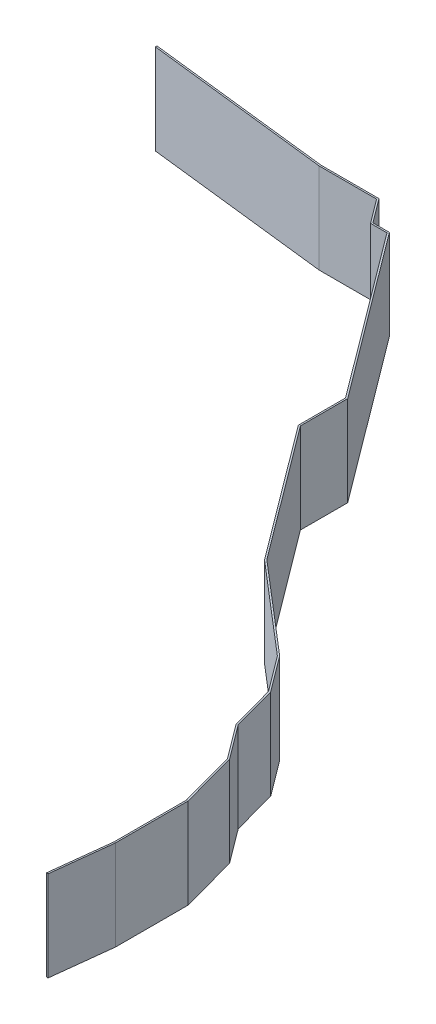
ISO-10303-21;
HEADER;
FILE_DESCRIPTION(('STEP AP214'),'2;1');
FILE_NAME('part.step','',(''),(''),'','','');
FILE_SCHEMA(('AUTOMOTIVE_DESIGN { 1 0 10303 214 1 1 1 1 }'));
ENDSEC;
DATA;
#1=APPLICATION_CONTEXT('core data for automotive mechanical design processes');
#2=APPLICATION_PROTOCOL_DEFINITION('international standard','automotive_design',2000,#1);
#3=PRODUCT_CONTEXT('',#1,'mechanical');
#4=PRODUCT('Part','Part','',(#3));
#5=PRODUCT_RELATED_PRODUCT_CATEGORY('part','',(#4));
#6=PRODUCT_DEFINITION_FORMATION('','',#4);
#7=PRODUCT_DEFINITION_CONTEXT('part definition',#1,'design');
#8=PRODUCT_DEFINITION('design','',#6,#7);
#9=PRODUCT_DEFINITION_SHAPE('','',#8);
#10=(LENGTH_UNIT() NAMED_UNIT(*) SI_UNIT(.MILLI.,.METRE.));
#11=(NAMED_UNIT(*) PLANE_ANGLE_UNIT() SI_UNIT($,.RADIAN.));
#12=(NAMED_UNIT(*) SI_UNIT($,.STERADIAN.) SOLID_ANGLE_UNIT());
#13=UNCERTAINTY_MEASURE_WITH_UNIT(LENGTH_MEASURE(1.E-05),#10,'distance_accuracy_value','');
#14=(GEOMETRIC_REPRESENTATION_CONTEXT(3) GLOBAL_UNCERTAINTY_ASSIGNED_CONTEXT((#13)) GLOBAL_UNIT_ASSIGNED_CONTEXT((#10,
#11,#12)) REPRESENTATION_CONTEXT('',''));
#15=CARTESIAN_POINT('',(0.,0.,0.));
#16=DIRECTION('',(0.,0.,1.));
#17=DIRECTION('',(1.,0.,0.));
#18=AXIS2_PLACEMENT_3D('',#15,#16,#17);
#19=CARTESIAN_POINT('',(0.,-143.002,0.));
#20=DIRECTION('',(0.,-1.,0.));
#21=DIRECTION('',(-1.,0.,0.));
#22=AXIS2_PLACEMENT_3D('',#19,#20,#21);
#23=PLANE('',#22);
#24=DIRECTION('',(-0.993474499826369,0.,-0.114054452761589));
#25=VECTOR('',#24,1.);
#26=CARTESIAN_POINT('',(-563.408799350654,-143.002,-356.070301017188));
#27=LINE('',#26,#25);
#28=CARTESIAN_POINT('',(-482.977728206431,-143.002,-346.836524200585));
#29=VERTEX_POINT('',#28);
#30=CARTESIAN_POINT('',(-776.424862409459,-143.002,-380.525312701783));
#31=VERTEX_POINT('',#30);
#32=EDGE_CURVE('E140',#29,#31,#27,.T.);
#33=ORIENTED_EDGE('',*,*,#32,.T.);
#34=DIRECTION('',(-0.114054452761553,0.,0.993474499826373));
#35=VECTOR('',#34,1.);
#36=CARTESIAN_POINT('',(-776.135164099445,-143.002,-383.048737931342));
#37=LINE('',#36,#35);
#38=CARTESIAN_POINT('',(-776.135164099445,-143.002,-383.048737931342));
#39=VERTEX_POINT('',#38);
#40=EDGE_CURVE('E377',#39,#31,#37,.T.);
#41=ORIENTED_EDGE('',*,*,#40,.F.);
#42=DIRECTION('',(-0.993474499826369,0.,-0.114054452761589));
#43=VECTOR('',#42,1.);
#44=CARTESIAN_POINT('',(-482.688029896416,-143.002,-349.359949430144));
#45=LINE('',#44,#43);
#46=CARTESIAN_POINT('',(-482.832404897786,-143.002,-349.376524200585));
#47=VERTEX_POINT('',#46);
#48=EDGE_CURVE('E233',#47,#39,#45,.T.);
#49=ORIENTED_EDGE('',*,*,#48,.F.);
#50=DIRECTION('',(1.,0.,0.));
#51=VECTOR('',#50,1.);
#52=CARTESIAN_POINT('',(-392.100936643089,-143.002,-349.376524200585));
#53=LINE('',#52,#51);
#54=CARTESIAN_POINT('',(-390.827778697246,-143.002,-349.376524200585));
#55=VERTEX_POINT('',#54);
#56=EDGE_CURVE('E222',#55,#47,#53,.F.);
#57=ORIENTED_EDGE('',*,*,#56,.F.);
#58=DIRECTION('',(-0.598408200865887,0.,-0.801191378595933));
#59=VECTOR('',#58,1.);
#60=CARTESIAN_POINT('',(-361.626176914644,-143.002,-310.279346796335));
#61=LINE('',#60,#59);
#62=CARTESIAN_POINT('',(-362.388045070435,-143.002,-311.299389966135));
#63=VERTEX_POINT('',#62);
#64=EDGE_CURVE('E207',#63,#55,#61,.T.);
#65=ORIENTED_EDGE('',*,*,#64,.F.);
#66=DIRECTION('',(1.,0.,0.));
#67=VECTOR('',#66,1.);
#68=CARTESIAN_POINT('',(-337.521866174316,-143.002,-311.299389966135));
#69=LINE('',#68,#67);
#70=CARTESIAN_POINT('',(-336.248708228473,-143.002,-311.299389966135));
#71=VERTEX_POINT('',#70);
#72=EDGE_CURVE('E220',#71,#63,#69,.F.);
#73=ORIENTED_EDGE('',*,*,#72,.F.);
#74=DIRECTION('',(-0.598408200865888,0.,-0.801191378595933));
#75=VECTOR('',#74,1.);
#76=CARTESIAN_POINT('',(-141.669839765425,-143.002,-50.7833882736982));
#77=LINE('',#76,#75);
#78=CARTESIAN_POINT('',(-141.164865867059,-143.002,-50.107293371921));
#79=VERTEX_POINT('',#78);
#80=EDGE_CURVE('E226',#79,#71,#77,.T.);
#81=ORIENTED_EDGE('',*,*,#80,.F.);
#82=DIRECTION('',(0.,0.,-1.));
#83=VECTOR('',#82,1.);
#84=CARTESIAN_POINT('',(-141.164865867059,-143.002,25.633038126932));
#85=LINE('',#84,#83);
#86=CARTESIAN_POINT('',(-141.164865867059,-143.002,24.7891761985098));
#87=VERTEX_POINT('',#86);
#88=EDGE_CURVE('E228',#87,#79,#85,.T.);
#89=ORIENTED_EDGE('',*,*,#88,.F.);
#90=DIRECTION('',(-0.598408200865888,0.,-0.801191378595933));
#91=VECTOR('',#90,1.);
#92=CARTESIAN_POINT('',(16.1849403912106,-143.002,235.460266627164));
#93=LINE('',#92,#91);
#94=CARTESIAN_POINT('',(16.0164872488637,-143.002,235.234729602186));
#95=VERTEX_POINT('',#94);
#96=EDGE_CURVE('E448',#95,#87,#93,.T.);
#97=ORIENTED_EDGE('',*,*,#96,.F.);
#98=DIRECTION('',(-0.759319771854139,0.,-0.650717668479486));
#99=VECTOR('',#98,1.);
#100=CARTESIAN_POINT('',(158.194553840272,-143.002,357.077704631492));
#101=LINE('',#100,#99);
#102=CARTESIAN_POINT('',(158.408303921621,-143.002,357.260882996824));
#103=VERTEX_POINT('',#102);
#104=EDGE_CURVE('E446',#103,#95,#101,.T.);
#105=ORIENTED_EDGE('',*,*,#104,.F.);
#106=DIRECTION('',(-0.598408200865888,0.,-0.801191378595933));
#107=VECTOR('',#106,1.);
#108=CARTESIAN_POINT('',(200.130594881591,-143.002,413.121647879442));
#109=LINE('',#108,#107);
#110=CARTESIAN_POINT('',(200.41871043104,-143.002,413.507397429537));
#111=VERTEX_POINT('',#110);
#112=EDGE_CURVE('E443',#111,#103,#109,.T.);
#113=ORIENTED_EDGE('',*,*,#112,.F.);
#114=DIRECTION('',(-0.263692156695389,0.,-0.96460688702566));
#115=VECTOR('',#114,1.);
#116=CARTESIAN_POINT('',(219.908842480194,-143.002,484.803850988343));
#117=LINE('',#116,#115);
#118=CARTESIAN_POINT('',(219.781882638231,-143.002,484.339421786245));
#119=VERTEX_POINT('',#118);
#120=EDGE_CURVE('E440',#119,#111,#117,.T.);
#121=ORIENTED_EDGE('',*,*,#120,.F.);
#122=DIRECTION('',(-0.598408200865888,0.,-0.801191378595933));
#123=VECTOR('',#122,1.);
#124=CARTESIAN_POINT('',(259.759952794934,-143.002,537.864900040231));
#125=LINE('',#124,#123);
#126=CARTESIAN_POINT('',(260.048068344382,-143.002,538.250649590326));
#127=VERTEX_POINT('',#126);
#128=EDGE_CURVE('E437',#127,#119,#125,.T.);
#129=ORIENTED_EDGE('',*,*,#128,.F.);
#130=DIRECTION('',(-0.263692156695389,0.,-0.96460688702566));
#131=VECTOR('',#130,1.);
#132=CARTESIAN_POINT('',(284.635727832471,-143.002,628.194264050768));
#133=LINE('',#132,#131);
#134=CARTESIAN_POINT('',(284.725626339426,-143.002,628.523119941018));
#135=VERTEX_POINT('',#134);
#136=EDGE_CURVE('E434',#135,#127,#133,.T.);
#137=ORIENTED_EDGE('',*,*,#136,.F.);
#138=DIRECTION('',(0.,0.,-1.));
#139=VECTOR('',#138,1.);
#140=CARTESIAN_POINT('',(284.725626339426,-143.002,746.088969302865));
#141=LINE('',#140,#139);
#142=CARTESIAN_POINT('',(284.725626339426,-143.002,743.823886816723));
#143=VERTEX_POINT('',#142);
#144=EDGE_CURVE('E431',#143,#135,#141,.T.);
#145=ORIENTED_EDGE('',*,*,#144,.F.);
#146=DIRECTION('',(0.11405445276159,0.,-0.993474499826369));
#147=VECTOR('',#146,1.);
#148=CARTESIAN_POINT('',(273.717090558877,-143.002,839.714045539964));
#149=LINE('',#148,#147);
#150=CARTESIAN_POINT('',(273.717090558877,-143.002,839.714045539964));
#151=VERTEX_POINT('',#150);
#152=EDGE_CURVE('E395',#151,#143,#149,.T.);
#153=ORIENTED_EDGE('',*,*,#152,.F.);
#154=DIRECTION('',(0.993474499826368,0.,0.114054452761603));
#155=VECTOR('',#154,1.);
#156=CARTESIAN_POINT('',(271.177090558877,-143.002,839.422444386573));
#157=LINE('',#156,#155);
#158=CARTESIAN_POINT('',(271.177090558877,-143.002,839.422444386573));
#159=VERTEX_POINT('',#158);
#160=EDGE_CURVE('E375',#159,#151,#157,.T.);
#161=ORIENTED_EDGE('',*,*,#160,.F.);
#162=DIRECTION('',(0.11405445276159,0.,-0.993474499826369));
#163=VECTOR('',#162,1.);
#164=CARTESIAN_POINT('',(271.177090558877,-143.002,839.422444386573));
#165=LINE('',#164,#163);
#166=CARTESIAN_POINT('',(282.185626339426,-143.002,743.532285663332));
#167=VERTEX_POINT('',#166);
#168=EDGE_CURVE('E398',#159,#167,#165,.T.);
#169=ORIENTED_EDGE('',*,*,#168,.T.);
#170=DIRECTION('',(0.,0.,-1.));
#171=VECTOR('',#170,1.);
#172=CARTESIAN_POINT('',(282.185626339426,-143.002,746.088969302865));
#173=LINE('',#172,#171);
#174=CARTESIAN_POINT('',(282.185626339426,-143.002,628.864042128775));
#175=VERTEX_POINT('',#174);
#176=EDGE_CURVE('E429',#167,#175,#173,.T.);
#177=ORIENTED_EDGE('',*,*,#176,.T.);
#178=DIRECTION('',(-0.263692156695389,0.,-0.96460688702566));
#179=VECTOR('',#178,1.);
#180=CARTESIAN_POINT('',(282.185626339426,-143.002,628.864042128775));
#181=LINE('',#180,#179);
#182=CARTESIAN_POINT('',(257.7249266933,-143.002,539.38485687043));
#183=VERTEX_POINT('',#182);
#184=EDGE_CURVE('E427',#175,#183,#181,.T.);
#185=ORIENTED_EDGE('',*,*,#184,.T.);
#186=DIRECTION('',(-0.598408200865888,0.,-0.801191378595933));
#187=VECTOR('',#186,1.);
#188=CARTESIAN_POINT('',(257.7249266933,-143.002,539.38485687043));
#189=LINE('',#188,#187);
#190=CARTESIAN_POINT('',(217.458740987149,-143.002,485.473629066349));
#191=VERTEX_POINT('',#190);
#192=EDGE_CURVE('E425',#183,#191,#189,.T.);
#193=ORIENTED_EDGE('',*,*,#192,.T.);
#194=DIRECTION('',(-0.263692156695389,0.,-0.96460688702566));
#195=VECTOR('',#194,1.);
#196=CARTESIAN_POINT('',(217.458740987149,-143.002,485.473629066349));
#197=LINE('',#196,#195);
#198=CARTESIAN_POINT('',(198.095568779958,-143.002,414.641604709641));
#199=VERTEX_POINT('',#198);
#200=EDGE_CURVE('E423',#191,#199,#197,.T.);
#201=ORIENTED_EDGE('',*,*,#200,.T.);
#202=DIRECTION('',(-0.598408200865888,0.,-0.801191378595933));
#203=VECTOR('',#202,1.);
#204=CARTESIAN_POINT('',(198.095568779958,-143.002,414.641604709641));
#205=LINE('',#204,#203);
#206=CARTESIAN_POINT('',(156.541730962334,-143.002,359.006376852002));
#207=VERTEX_POINT('',#206);
#208=EDGE_CURVE('E420',#199,#207,#205,.T.);
#209=ORIENTED_EDGE('',*,*,#208,.T.);
#210=DIRECTION('',(-0.759319771854139,0.,-0.650717668479486));
#211=VECTOR('',#210,1.);
#212=CARTESIAN_POINT('',(68.7626873547896,-143.002,283.781976388697));
#213=LINE('',#212,#211);
#214=CARTESIAN_POINT('',(14.1499142895769,-143.002,236.980223457363));
#215=VERTEX_POINT('',#214);
#216=EDGE_CURVE('E417',#207,#215,#213,.T.);
#217=ORIENTED_EDGE('',*,*,#216,.T.);
#218=DIRECTION('',(-0.598408200865888,0.,-0.801191378595933));
#219=VECTOR('',#218,1.);
#220=CARTESIAN_POINT('',(-95.8604169862648,-143.002,89.6905826283262));
#221=LINE('',#220,#219);
#222=CARTESIAN_POINT('',(-143.704865867059,-143.002,25.633038126932));
#223=VERTEX_POINT('',#222);
#224=EDGE_CURVE('E415',#215,#223,#221,.T.);
#225=ORIENTED_EDGE('',*,*,#224,.T.);
#226=DIRECTION('',(0.,0.,-1.));
#227=VECTOR('',#226,1.);
#228=CARTESIAN_POINT('',(-143.704865867059,-143.002,25.633038126932));
#229=LINE('',#228,#227);
#230=CARTESIAN_POINT('',(-143.704865867059,-143.002,-49.2634314434988));
#231=VERTEX_POINT('',#230);
#232=EDGE_CURVE('E412',#223,#231,#229,.T.);
#233=ORIENTED_EDGE('',*,*,#232,.T.);
#234=DIRECTION('',(-0.598408200865887,0.,-0.801191378595933));
#235=VECTOR('',#234,1.);
#236=CARTESIAN_POINT('',(-262.069299431715,-143.002,-207.73813745049));
#237=LINE('',#236,#235);
#238=CARTESIAN_POINT('',(-337.521866174316,-143.002,-308.759389966135));
#239=VERTEX_POINT('',#238);
#240=EDGE_CURVE('E410',#231,#239,#237,.T.);
#241=ORIENTED_EDGE('',*,*,#240,.T.);
#242=DIRECTION('',(-1.,0.,0.));
#243=VECTOR('',#242,1.);
#244=CARTESIAN_POINT('',(-337.521866174316,-143.002,-308.759389966135));
#245=LINE('',#244,#243);
#246=CARTESIAN_POINT('',(-363.661203016278,-143.002,-308.759389966135));
#247=VERTEX_POINT('',#246);
#248=EDGE_CURVE('E408',#239,#247,#245,.T.);
#249=ORIENTED_EDGE('',*,*,#248,.T.);
#250=DIRECTION('',(-0.598408200865887,0.,-0.801191378595933));
#251=VECTOR('',#250,1.);
#252=CARTESIAN_POINT('',(-363.661203016278,-143.002,-308.759389966135));
#253=LINE('',#252,#251);
#254=CARTESIAN_POINT('',(-392.100936643089,-143.002,-346.836524200585));
#255=VERTEX_POINT('',#254);
#256=EDGE_CURVE('E406',#247,#255,#253,.T.);
#257=ORIENTED_EDGE('',*,*,#256,.T.);
#258=DIRECTION('',(-1.,0.,0.));
#259=VECTOR('',#258,1.);
#260=CARTESIAN_POINT('',(-392.100936643089,-143.002,-346.836524200585));
#261=LINE('',#260,#259);
#262=EDGE_CURVE('E404',#255,#29,#261,.T.);
#263=ORIENTED_EDGE('',*,*,#262,.T.);
#264=EDGE_LOOP('',(#33,#41,#49,#57,#65,#73,#81,#89,#97,#105,#113,#121,#129,#137,#145,#153,#161,
#169,#177,#185,#193,#201,#209,#217,#225,#233,#241,#249,#257,#263));
#265=FACE_BOUND('',#264,.T.);
#266=ADVANCED_FACE('F33',(#265),#23,.T.);
#267=CARTESIAN_POINT('',(0.,0.,0.));
#268=DIRECTION('',(0.,-1.,0.));
#269=DIRECTION('',(-1.,0.,0.));
#270=AXIS2_PLACEMENT_3D('',#267,#268,#269);
#271=PLANE('',#270);
#272=DIRECTION('',(-0.993474499826369,0.,-0.114054452761589));
#273=VECTOR('',#272,1.);
#274=CARTESIAN_POINT('',(-563.119101040639,0.,-358.593726246747));
#275=LINE('',#274,#273);
#276=CARTESIAN_POINT('',(-482.832404897786,0.,-349.376524200585));
#277=VERTEX_POINT('',#276);
#278=CARTESIAN_POINT('',(-776.135164099445,0.,-383.048737931342));
#279=VERTEX_POINT('',#278);
#280=EDGE_CURVE('E132',#277,#279,#275,.T.);
#281=ORIENTED_EDGE('',*,*,#280,.T.);
#282=DIRECTION('',(0.114054452761553,0.,-0.993474499826373));
#283=VECTOR('',#282,1.);
#284=CARTESIAN_POINT('',(-776.135164099445,0.,-383.048737931342));
#285=LINE('',#284,#283);
#286=CARTESIAN_POINT('',(-776.424862409459,0.,-380.525312701783));
#287=VERTEX_POINT('',#286);
#288=EDGE_CURVE('E365',#287,#279,#285,.T.);
#289=ORIENTED_EDGE('',*,*,#288,.F.);
#290=DIRECTION('',(-0.993474499826369,0.,-0.114054452761589));
#291=VECTOR('',#290,1.);
#292=CARTESIAN_POINT('',(-482.977728206431,0.,-346.836524200585));
#293=LINE('',#292,#291);
#294=CARTESIAN_POINT('',(-482.977728206431,0.,-346.836524200585));
#295=VERTEX_POINT('',#294);
#296=EDGE_CURVE('E235',#295,#287,#293,.T.);
#297=ORIENTED_EDGE('',*,*,#296,.F.);
#298=DIRECTION('',(-1.,0.,0.));
#299=VECTOR('',#298,1.);
#300=CARTESIAN_POINT('',(-392.100936643089,0.,-346.836524200585));
#301=LINE('',#300,#299);
#302=CARTESIAN_POINT('',(-392.100936643089,0.,-346.836524200585));
#303=VERTEX_POINT('',#302);
#304=EDGE_CURVE('E238',#303,#295,#301,.T.);
#305=ORIENTED_EDGE('',*,*,#304,.F.);
#306=DIRECTION('',(-0.598408200865887,0.,-0.801191378595933));
#307=VECTOR('',#306,1.);
#308=CARTESIAN_POINT('',(-363.661203016278,0.,-308.759389966135));
#309=LINE('',#308,#307);
#310=CARTESIAN_POINT('',(-363.661203016278,0.,-308.759389966135));
#311=VERTEX_POINT('',#310);
#312=EDGE_CURVE('E241',#311,#303,#309,.T.);
#313=ORIENTED_EDGE('',*,*,#312,.F.);
#314=DIRECTION('',(-1.,0.,0.));
#315=VECTOR('',#314,1.);
#316=CARTESIAN_POINT('',(-337.521866174316,0.,-308.759389966135));
#317=LINE('',#316,#315);
#318=CARTESIAN_POINT('',(-337.521866174316,0.,-308.759389966135));
#319=VERTEX_POINT('',#318);
#320=EDGE_CURVE('E243',#319,#311,#317,.T.);
#321=ORIENTED_EDGE('',*,*,#320,.F.);
#322=DIRECTION('',(-0.598408200865888,0.,-0.801191378595933));
#323=VECTOR('',#322,1.);
#324=CARTESIAN_POINT('',(-143.704865867059,0.,-49.2634314434988));
#325=LINE('',#324,#323);
#326=CARTESIAN_POINT('',(-143.704865867059,0.,-49.2634314434988));
#327=VERTEX_POINT('',#326);
#328=EDGE_CURVE('E245',#327,#319,#325,.T.);
#329=ORIENTED_EDGE('',*,*,#328,.F.);
#330=DIRECTION('',(0.,0.,-1.));
#331=VECTOR('',#330,1.);
#332=CARTESIAN_POINT('',(-143.704865867059,0.,25.633038126932));
#333=LINE('',#332,#331);
#334=CARTESIAN_POINT('',(-143.704865867059,0.,25.633038126932));
#335=VERTEX_POINT('',#334);
#336=EDGE_CURVE('E247',#335,#327,#333,.T.);
#337=ORIENTED_EDGE('',*,*,#336,.F.);
#338=DIRECTION('',(-0.598408200865888,0.,-0.801191378595933));
#339=VECTOR('',#338,1.);
#340=CARTESIAN_POINT('',(14.1499142895769,0.,236.980223457363));
#341=LINE('',#340,#339);
#342=CARTESIAN_POINT('',(14.1499142895769,0.,236.980223457363));
#343=VERTEX_POINT('',#342);
#344=EDGE_CURVE('E249',#343,#335,#341,.T.);
#345=ORIENTED_EDGE('',*,*,#344,.F.);
#346=DIRECTION('',(-0.759319771854139,0.,-0.650717668479486));
#347=VECTOR('',#346,1.);
#348=CARTESIAN_POINT('',(156.541730962334,0.,359.006376852002));
#349=LINE('',#348,#347);
#350=CARTESIAN_POINT('',(156.541730962334,0.,359.006376852002));
#351=VERTEX_POINT('',#350);
#352=EDGE_CURVE('E251',#351,#343,#349,.T.);
#353=ORIENTED_EDGE('',*,*,#352,.F.);
#354=DIRECTION('',(-0.598408200865888,0.,-0.801191378595933));
#355=VECTOR('',#354,1.);
#356=CARTESIAN_POINT('',(198.095568779958,0.,414.641604709641));
#357=LINE('',#356,#355);
#358=CARTESIAN_POINT('',(198.095568779958,0.,414.641604709641));
#359=VERTEX_POINT('',#358);
#360=EDGE_CURVE('E253',#359,#351,#357,.T.);
#361=ORIENTED_EDGE('',*,*,#360,.F.);
#362=DIRECTION('',(-0.263692156695389,0.,-0.96460688702566));
#363=VECTOR('',#362,1.);
#364=CARTESIAN_POINT('',(217.458740987149,0.,485.473629066349));
#365=LINE('',#364,#363);
#366=CARTESIAN_POINT('',(217.458740987149,0.,485.473629066349));
#367=VERTEX_POINT('',#366);
#368=EDGE_CURVE('E255',#367,#359,#365,.T.);
#369=ORIENTED_EDGE('',*,*,#368,.F.);
#370=DIRECTION('',(-0.598408200865888,0.,-0.801191378595933));
#371=VECTOR('',#370,1.);
#372=CARTESIAN_POINT('',(257.7249266933,0.,539.38485687043));
#373=LINE('',#372,#371);
#374=CARTESIAN_POINT('',(257.7249266933,0.,539.38485687043));
#375=VERTEX_POINT('',#374);
#376=EDGE_CURVE('E257',#375,#367,#373,.T.);
#377=ORIENTED_EDGE('',*,*,#376,.F.);
#378=DIRECTION('',(-0.263692156695389,0.,-0.96460688702566));
#379=VECTOR('',#378,1.);
#380=CARTESIAN_POINT('',(282.185626339426,0.,628.864042128775));
#381=LINE('',#380,#379);
#382=CARTESIAN_POINT('',(282.185626339426,0.,628.864042128775));
#383=VERTEX_POINT('',#382);
#384=EDGE_CURVE('E259',#383,#375,#381,.T.);
#385=ORIENTED_EDGE('',*,*,#384,.F.);
#386=DIRECTION('',(0.,0.,-1.));
#387=VECTOR('',#386,1.);
#388=CARTESIAN_POINT('',(282.185626339426,0.,746.088969302865));
#389=LINE('',#388,#387);
#390=CARTESIAN_POINT('',(282.185626339426,0.,743.532285663331));
#391=VERTEX_POINT('',#390);
#392=EDGE_CURVE('E261',#391,#383,#389,.T.);
#393=ORIENTED_EDGE('',*,*,#392,.F.);
#394=DIRECTION('',(0.11405445276159,0.,-0.993474499826369));
#395=VECTOR('',#394,1.);
#396=CARTESIAN_POINT('',(271.177090558877,0.,839.422444386573));
#397=LINE('',#396,#395);
#398=CARTESIAN_POINT('',(271.177090558877,0.,839.422444386573));
#399=VERTEX_POINT('',#398);
#400=EDGE_CURVE('E389',#399,#391,#397,.T.);
#401=ORIENTED_EDGE('',*,*,#400,.F.);
#402=DIRECTION('',(-0.993474499826368,0.,-0.114054452761603));
#403=VECTOR('',#402,1.);
#404=CARTESIAN_POINT('',(271.177090558877,0.,839.422444386573));
#405=LINE('',#404,#403);
#406=CARTESIAN_POINT('',(273.717090558877,0.,839.714045539964));
#407=VERTEX_POINT('',#406);
#408=EDGE_CURVE('E386',#407,#399,#405,.T.);
#409=ORIENTED_EDGE('',*,*,#408,.F.);
#410=DIRECTION('',(0.11405445276159,0.,-0.993474499826369));
#411=VECTOR('',#410,1.);
#412=CARTESIAN_POINT('',(273.717090558877,0.,839.714045539964));
#413=LINE('',#412,#411);
#414=CARTESIAN_POINT('',(284.725626339426,0.,743.823886816723));
#415=VERTEX_POINT('',#414);
#416=EDGE_CURVE('E392',#407,#415,#413,.T.);
#417=ORIENTED_EDGE('',*,*,#416,.T.);
#418=DIRECTION('',(0.,0.,-1.));
#419=VECTOR('',#418,1.);
#420=CARTESIAN_POINT('',(284.725626339426,0.,746.088969302865));
#421=LINE('',#420,#419);
#422=CARTESIAN_POINT('',(284.725626339426,0.,628.523119941018));
#423=VERTEX_POINT('',#422);
#424=EDGE_CURVE('E263',#415,#423,#421,.T.);
#425=ORIENTED_EDGE('',*,*,#424,.T.);
#426=DIRECTION('',(-0.263692156695389,0.,-0.96460688702566));
#427=VECTOR('',#426,1.);
#428=CARTESIAN_POINT('',(284.635727832471,0.,628.194264050768));
#429=LINE('',#428,#427);
#430=CARTESIAN_POINT('',(260.048068344382,0.,538.250649590326));
#431=VERTEX_POINT('',#430);
#432=EDGE_CURVE('E266',#423,#431,#429,.T.);
#433=ORIENTED_EDGE('',*,*,#432,.T.);
#434=DIRECTION('',(-0.598408200865888,0.,-0.801191378595933));
#435=VECTOR('',#434,1.);
#436=CARTESIAN_POINT('',(259.759952794934,0.,537.864900040231));
#437=LINE('',#436,#435);
#438=CARTESIAN_POINT('',(219.781882638231,0.,484.339421786245));
#439=VERTEX_POINT('',#438);
#440=EDGE_CURVE('E269',#431,#439,#437,.T.);
#441=ORIENTED_EDGE('',*,*,#440,.T.);
#442=DIRECTION('',(-0.263692156695389,0.,-0.96460688702566));
#443=VECTOR('',#442,1.);
#444=CARTESIAN_POINT('',(219.908842480194,0.,484.803850988343));
#445=LINE('',#444,#443);
#446=CARTESIAN_POINT('',(200.41871043104,0.,413.507397429537));
#447=VERTEX_POINT('',#446);
#448=EDGE_CURVE('E272',#439,#447,#445,.T.);
#449=ORIENTED_EDGE('',*,*,#448,.T.);
#450=DIRECTION('',(-0.598408200865888,0.,-0.801191378595933));
#451=VECTOR('',#450,1.);
#452=CARTESIAN_POINT('',(200.130594881591,0.,413.121647879442));
#453=LINE('',#452,#451);
#454=CARTESIAN_POINT('',(158.408303921621,0.,357.260882996824));
#455=VERTEX_POINT('',#454);
#456=EDGE_CURVE('E275',#447,#455,#453,.T.);
#457=ORIENTED_EDGE('',*,*,#456,.T.);
#458=DIRECTION('',(-0.759319771854139,0.,-0.650717668479486));
#459=VECTOR('',#458,1.);
#460=CARTESIAN_POINT('',(70.4155102327275,0.,281.853304168188));
#461=LINE('',#460,#459);
#462=CARTESIAN_POINT('',(16.0164872488637,0.,235.234729602186));
#463=VERTEX_POINT('',#462);
#464=EDGE_CURVE('E278',#455,#463,#461,.T.);
#465=ORIENTED_EDGE('',*,*,#464,.T.);
#466=DIRECTION('',(-0.598408200865888,0.,-0.801191378595933));
#467=VECTOR('',#466,1.);
#468=CARTESIAN_POINT('',(-93.8253908846311,0.,88.1706257981268));
#469=LINE('',#468,#467);
#470=CARTESIAN_POINT('',(-141.164865867059,0.,24.7891761985098));
#471=VERTEX_POINT('',#470);
#472=EDGE_CURVE('E281',#463,#471,#469,.T.);
#473=ORIENTED_EDGE('',*,*,#472,.T.);
#474=DIRECTION('',(0.,0.,-1.));
#475=VECTOR('',#474,1.);
#476=CARTESIAN_POINT('',(-141.164865867059,0.,25.633038126932));
#477=LINE('',#476,#475);
#478=CARTESIAN_POINT('',(-141.164865867059,0.,-50.107293371921));
#479=VERTEX_POINT('',#478);
#480=EDGE_CURVE('E284',#471,#479,#477,.T.);
#481=ORIENTED_EDGE('',*,*,#480,.T.);
#482=DIRECTION('',(-0.598408200865888,0.,-0.801191378595933));
#483=VECTOR('',#482,1.);
#484=CARTESIAN_POINT('',(-260.034273330082,0.,-209.258094280689));
#485=LINE('',#484,#483);
#486=CARTESIAN_POINT('',(-336.248708228473,0.,-311.299389966135));
#487=VERTEX_POINT('',#486);
#488=EDGE_CURVE('E287',#479,#487,#485,.T.);
#489=ORIENTED_EDGE('',*,*,#488,.T.);
#490=DIRECTION('',(1.,0.,0.));
#491=VECTOR('',#490,1.);
#492=CARTESIAN_POINT('',(-337.521866174316,0.,-311.299389966135));
#493=LINE('',#492,#491);
#494=CARTESIAN_POINT('',(-362.388045070435,0.,-311.299389966135));
#495=VERTEX_POINT('',#494);
#496=EDGE_CURVE('E290',#487,#495,#493,.F.);
#497=ORIENTED_EDGE('',*,*,#496,.T.);
#498=DIRECTION('',(-0.598408200865887,0.,-0.801191378595933));
#499=VECTOR('',#498,1.);
#500=CARTESIAN_POINT('',(-361.626176914644,0.,-310.279346796335));
#501=LINE('',#500,#499);
#502=CARTESIAN_POINT('',(-390.827778697246,0.,-349.376524200585));
#503=VERTEX_POINT('',#502);
#504=EDGE_CURVE('E209',#495,#503,#501,.T.);
#505=ORIENTED_EDGE('',*,*,#504,.T.);
#506=DIRECTION('',(1.,0.,0.));
#507=VECTOR('',#506,1.);
#508=CARTESIAN_POINT('',(-392.100936643089,0.,-349.376524200585));
#509=LINE('',#508,#507);
#510=EDGE_CURVE('E293',#503,#277,#509,.F.);
#511=ORIENTED_EDGE('',*,*,#510,.T.);
#512=EDGE_LOOP('',(#281,#289,#297,#305,#313,#321,#329,#337,#345,#353,#361,#369,#377,#385,#393,
#401,#409,#417,#425,#433,#441,#449,#457,#465,#473,#481,#489,#497,#505,#511));
#513=FACE_BOUND('',#512,.T.);
#514=ADVANCED_FACE('F362',(#513),#271,.F.);
#515=CARTESIAN_POINT('',(-482.977728206431,-143.002,-346.836524200585));
#516=DIRECTION('',(0.114054452761589,0.,-0.993474499826369));
#517=DIRECTION('',(-0.993474499826369,0.,-0.114054452761589));
#518=AXIS2_PLACEMENT_3D('',#515,#516,#517);
#519=PLANE('',#518);
#520=ORIENTED_EDGE('',*,*,#296,.T.);
#521=DIRECTION('',(0.,1.,0.));
#522=VECTOR('',#521,1.);
#523=CARTESIAN_POINT('',(-776.424862409459,-143.002,-380.525312701783));
#524=LINE('',#523,#522);
#525=EDGE_CURVE('E372',#31,#287,#524,.T.);
#526=ORIENTED_EDGE('',*,*,#525,.F.);
#527=ORIENTED_EDGE('',*,*,#32,.F.);
#528=DIRECTION('',(0.,1.,0.));
#529=VECTOR('',#528,1.);
#530=CARTESIAN_POINT('',(-482.977728206431,-143.002,-346.836524200585));
#531=LINE('',#530,#529);
#532=EDGE_CURVE('E37',#29,#295,#531,.T.);
#533=ORIENTED_EDGE('',*,*,#532,.T.);
#534=EDGE_LOOP('',(#520,#526,#527,#533));
#535=FACE_BOUND('',#534,.T.);
#536=ADVANCED_FACE('F35',(#535),#519,.F.);
#537=CARTESIAN_POINT('',(282.185626339426,-143.002,746.088969302865));
#538=DIRECTION('',(1.,0.,0.));
#539=DIRECTION('',(0.,0.,-1.));
#540=AXIS2_PLACEMENT_3D('',#537,#538,#539);
#541=PLANE('',#540);
#542=DIRECTION('',(0.,-1.,0.));
#543=VECTOR('',#542,1.);
#544=CARTESIAN_POINT('',(282.185626339426,-143.002,743.532285663332));
#545=LINE('',#544,#543);
#546=EDGE_CURVE('E239',#391,#167,#545,.T.);
#547=ORIENTED_EDGE('',*,*,#546,.F.);
#548=ORIENTED_EDGE('',*,*,#392,.T.);
#549=DIRECTION('',(0.,1.,0.));
#550=VECTOR('',#549,1.);
#551=CARTESIAN_POINT('',(282.185626339426,-143.002,628.864042128775));
#552=LINE('',#551,#550);
#553=EDGE_CURVE('E321',#175,#383,#552,.T.);
#554=ORIENTED_EDGE('',*,*,#553,.F.);
#555=ORIENTED_EDGE('',*,*,#176,.F.);
#556=EDGE_LOOP('',(#547,#548,#554,#555));
#557=FACE_BOUND('',#556,.T.);
#558=ADVANCED_FACE('F513',(#557),#541,.F.);
#559=CARTESIAN_POINT('',(-563.119101040639,-143.002,-358.593726246747));
#560=DIRECTION('',(0.114054452761589,0.,-0.993474499826369));
#561=DIRECTION('',(-0.993474499826369,0.,-0.114054452761589));
#562=AXIS2_PLACEMENT_3D('',#559,#560,#561);
#563=PLANE('',#562);
#564=ORIENTED_EDGE('',*,*,#280,.F.);
#565=DIRECTION('',(0.,1.,0.));
#566=VECTOR('',#565,1.);
#567=CARTESIAN_POINT('',(-482.832404897786,-143.002,-349.376524200585));
#568=LINE('',#567,#566);
#569=EDGE_CURVE('E11',#47,#277,#568,.T.);
#570=ORIENTED_EDGE('',*,*,#569,.F.);
#571=ORIENTED_EDGE('',*,*,#48,.T.);
#572=DIRECTION('',(0.,-1.,0.));
#573=VECTOR('',#572,1.);
#574=CARTESIAN_POINT('',(-776.135164099445,-143.002,-383.048737931342));
#575=LINE('',#574,#573);
#576=EDGE_CURVE('E635',#279,#39,#575,.T.);
#577=ORIENTED_EDGE('',*,*,#576,.F.);
#578=EDGE_LOOP('',(#564,#570,#571,#577));
#579=FACE_BOUND('',#578,.T.);
#580=ADVANCED_FACE('F536',(#579),#563,.T.);
#581=CARTESIAN_POINT('',(-392.100936643089,-143.002,-349.376524200585));
#582=DIRECTION('',(0.,0.,-1.));
#583=DIRECTION('',(-1.,0.,0.));
#584=AXIS2_PLACEMENT_3D('',#581,#582,#583);
#585=PLANE('',#584);
#586=ORIENTED_EDGE('',*,*,#510,.F.);
#587=DIRECTION('',(0.,1.,0.));
#588=VECTOR('',#587,1.);
#589=CARTESIAN_POINT('',(-390.827778697246,-143.002,-349.376524200585));
#590=LINE('',#589,#588);
#591=EDGE_CURVE('E43',#55,#503,#590,.T.);
#592=ORIENTED_EDGE('',*,*,#591,.F.);
#593=ORIENTED_EDGE('',*,*,#56,.T.);
#594=ORIENTED_EDGE('',*,*,#569,.T.);
#595=EDGE_LOOP('',(#586,#592,#593,#594));
#596=FACE_BOUND('',#595,.T.);
#597=ADVANCED_FACE('F538',(#596),#585,.T.);
#598=CARTESIAN_POINT('',(-361.626176914644,-143.002,-310.279346796335));
#599=DIRECTION('',(0.801191378595933,0.,-0.598408200865887));
#600=DIRECTION('',(-0.598408200865887,0.,-0.801191378595933));
#601=AXIS2_PLACEMENT_3D('',#598,#599,#600);
#602=PLANE('',#601);
#603=ORIENTED_EDGE('',*,*,#504,.F.);
#604=DIRECTION('',(0.,1.,0.));
#605=VECTOR('',#604,1.);
#606=CARTESIAN_POINT('',(-362.388045070435,-143.002,-311.299389966135));
#607=LINE('',#606,#605);
#608=EDGE_CURVE('E204',#63,#495,#607,.T.);
#609=ORIENTED_EDGE('',*,*,#608,.F.);
#610=ORIENTED_EDGE('',*,*,#64,.T.);
#611=ORIENTED_EDGE('',*,*,#591,.T.);
#612=EDGE_LOOP('',(#603,#609,#610,#611));
#613=FACE_BOUND('',#612,.T.);
#614=ADVANCED_FACE('F206',(#613),#602,.T.);
#615=CARTESIAN_POINT('',(-337.521866174316,-143.002,-311.299389966135));
#616=DIRECTION('',(0.,0.,-1.));
#617=DIRECTION('',(-1.,0.,0.));
#618=AXIS2_PLACEMENT_3D('',#615,#616,#617);
#619=PLANE('',#618);
#620=ORIENTED_EDGE('',*,*,#496,.F.);
#621=DIRECTION('',(0.,1.,0.));
#622=VECTOR('',#621,1.);
#623=CARTESIAN_POINT('',(-336.248708228473,-143.002,-311.299389966135));
#624=LINE('',#623,#622);
#625=EDGE_CURVE('E214',#71,#487,#624,.T.);
#626=ORIENTED_EDGE('',*,*,#625,.F.);
#627=ORIENTED_EDGE('',*,*,#72,.T.);
#628=ORIENTED_EDGE('',*,*,#608,.T.);
#629=EDGE_LOOP('',(#620,#626,#627,#628));
#630=FACE_BOUND('',#629,.T.);
#631=ADVANCED_FACE('F225',(#630),#619,.T.);
#632=CARTESIAN_POINT('',(-260.034273330082,-143.002,-209.258094280689));
#633=DIRECTION('',(0.801191378595933,0.,-0.598408200865887));
#634=DIRECTION('',(-0.598408200865887,0.,-0.801191378595933));
#635=AXIS2_PLACEMENT_3D('',#632,#633,#634);
#636=PLANE('',#635);
#637=ORIENTED_EDGE('',*,*,#488,.F.);
#638=DIRECTION('',(0.,1.,0.));
#639=VECTOR('',#638,1.);
#640=CARTESIAN_POINT('',(-141.164865867059,-143.002,-50.107293371921));
#641=LINE('',#640,#639);
#642=EDGE_CURVE('E299',#79,#479,#641,.T.);
#643=ORIENTED_EDGE('',*,*,#642,.F.);
#644=ORIENTED_EDGE('',*,*,#80,.T.);
#645=ORIENTED_EDGE('',*,*,#625,.T.);
#646=EDGE_LOOP('',(#637,#643,#644,#645));
#647=FACE_BOUND('',#646,.T.);
#648=ADVANCED_FACE('F458',(#647),#636,.T.);
#649=CARTESIAN_POINT('',(-141.164865867059,-143.002,25.633038126932));
#650=DIRECTION('',(1.,0.,0.));
#651=DIRECTION('',(0.,0.,-1.));
#652=AXIS2_PLACEMENT_3D('',#649,#650,#651);
#653=PLANE('',#652);
#654=ORIENTED_EDGE('',*,*,#480,.F.);
#655=DIRECTION('',(0.,1.,0.));
#656=VECTOR('',#655,1.);
#657=CARTESIAN_POINT('',(-141.164865867059,-143.002,24.7891761985098));
#658=LINE('',#657,#656);
#659=EDGE_CURVE('E302',#87,#471,#658,.T.);
#660=ORIENTED_EDGE('',*,*,#659,.F.);
#661=ORIENTED_EDGE('',*,*,#88,.T.);
#662=ORIENTED_EDGE('',*,*,#642,.T.);
#663=EDGE_LOOP('',(#654,#660,#661,#662));
#664=FACE_BOUND('',#663,.T.);
#665=ADVANCED_FACE('F454',(#664),#653,.T.);
#666=CARTESIAN_POINT('',(-93.8253908846311,-143.002,88.1706257981268));
#667=DIRECTION('',(0.801191378595933,0.,-0.598408200865888));
#668=DIRECTION('',(-0.598408200865888,0.,-0.801191378595933));
#669=AXIS2_PLACEMENT_3D('',#666,#667,#668);
#670=PLANE('',#669);
#671=ORIENTED_EDGE('',*,*,#472,.F.);
#672=DIRECTION('',(0.,1.,0.));
#673=VECTOR('',#672,1.);
#674=CARTESIAN_POINT('',(16.0164872488637,-143.002,235.234729602186));
#675=LINE('',#674,#673);
#676=EDGE_CURVE('E304',#95,#463,#675,.T.);
#677=ORIENTED_EDGE('',*,*,#676,.F.);
#678=ORIENTED_EDGE('',*,*,#96,.T.);
#679=ORIENTED_EDGE('',*,*,#659,.T.);
#680=EDGE_LOOP('',(#671,#677,#678,#679));
#681=FACE_BOUND('',#680,.T.);
#682=ADVANCED_FACE('F461',(#681),#670,.T.);
#683=CARTESIAN_POINT('',(70.4155102327275,-143.002,281.853304168188));
#684=DIRECTION('',(0.650717668479486,0.,-0.759319771854139));
#685=DIRECTION('',(-0.759319771854139,0.,-0.650717668479486));
#686=AXIS2_PLACEMENT_3D('',#683,#684,#685);
#687=PLANE('',#686);
#688=ORIENTED_EDGE('',*,*,#464,.F.);
#689=DIRECTION('',(0.,1.,0.));
#690=VECTOR('',#689,1.);
#691=CARTESIAN_POINT('',(158.408303921621,-143.002,357.260882996824));
#692=LINE('',#691,#690);
#693=EDGE_CURVE('E307',#103,#455,#692,.T.);
#694=ORIENTED_EDGE('',*,*,#693,.F.);
#695=ORIENTED_EDGE('',*,*,#104,.T.);
#696=ORIENTED_EDGE('',*,*,#676,.T.);
#697=EDGE_LOOP('',(#688,#694,#695,#696));
#698=FACE_BOUND('',#697,.T.);
#699=ADVANCED_FACE('F463',(#698),#687,.T.);
#700=CARTESIAN_POINT('',(200.130594881591,-143.002,413.121647879442));
#701=DIRECTION('',(0.801191378595933,0.,-0.598408200865888));
#702=DIRECTION('',(-0.598408200865888,0.,-0.801191378595933));
#703=AXIS2_PLACEMENT_3D('',#700,#701,#702);
#704=PLANE('',#703);
#705=ORIENTED_EDGE('',*,*,#456,.F.);
#706=DIRECTION('',(0.,1.,0.));
#707=VECTOR('',#706,1.);
#708=CARTESIAN_POINT('',(200.41871043104,-143.002,413.507397429537));
#709=LINE('',#708,#707);
#710=EDGE_CURVE('E310',#111,#447,#709,.T.);
#711=ORIENTED_EDGE('',*,*,#710,.F.);
#712=ORIENTED_EDGE('',*,*,#112,.T.);
#713=ORIENTED_EDGE('',*,*,#693,.T.);
#714=EDGE_LOOP('',(#705,#711,#712,#713));
#715=FACE_BOUND('',#714,.T.);
#716=ADVANCED_FACE('F468',(#715),#704,.T.);
#717=CARTESIAN_POINT('',(219.908842480194,-143.002,484.803850988343));
#718=DIRECTION('',(0.96460688702566,0.,-0.263692156695389));
#719=DIRECTION('',(-0.263692156695389,0.,-0.96460688702566));
#720=AXIS2_PLACEMENT_3D('',#717,#718,#719);
#721=PLANE('',#720);
#722=ORIENTED_EDGE('',*,*,#448,.F.);
#723=DIRECTION('',(0.,1.,0.));
#724=VECTOR('',#723,1.);
#725=CARTESIAN_POINT('',(219.781882638231,-143.002,484.339421786245));
#726=LINE('',#725,#724);
#727=EDGE_CURVE('E312',#119,#439,#726,.T.);
#728=ORIENTED_EDGE('',*,*,#727,.F.);
#729=ORIENTED_EDGE('',*,*,#120,.T.);
#730=ORIENTED_EDGE('',*,*,#710,.T.);
#731=EDGE_LOOP('',(#722,#728,#729,#730));
#732=FACE_BOUND('',#731,.T.);
#733=ADVANCED_FACE('F471',(#732),#721,.T.);
#734=CARTESIAN_POINT('',(259.759952794934,-143.002,537.864900040231));
#735=DIRECTION('',(0.801191378595933,0.,-0.598408200865888));
#736=DIRECTION('',(-0.598408200865888,0.,-0.801191378595933));
#737=AXIS2_PLACEMENT_3D('',#734,#735,#736);
#738=PLANE('',#737);
#739=ORIENTED_EDGE('',*,*,#440,.F.);
#740=DIRECTION('',(0.,1.,0.));
#741=VECTOR('',#740,1.);
#742=CARTESIAN_POINT('',(260.048068344382,-143.002,538.250649590326));
#743=LINE('',#742,#741);
#744=EDGE_CURVE('E314',#127,#431,#743,.T.);
#745=ORIENTED_EDGE('',*,*,#744,.F.);
#746=ORIENTED_EDGE('',*,*,#128,.T.);
#747=ORIENTED_EDGE('',*,*,#727,.T.);
#748=EDGE_LOOP('',(#739,#745,#746,#747));
#749=FACE_BOUND('',#748,.T.);
#750=ADVANCED_FACE('F476',(#749),#738,.T.);
#751=CARTESIAN_POINT('',(284.635727832471,-143.002,628.194264050768));
#752=DIRECTION('',(0.96460688702566,0.,-0.263692156695389));
#753=DIRECTION('',(-0.263692156695389,0.,-0.96460688702566));
#754=AXIS2_PLACEMENT_3D('',#751,#752,#753);
#755=PLANE('',#754);
#756=ORIENTED_EDGE('',*,*,#432,.F.);
#757=DIRECTION('',(0.,1.,0.));
#758=VECTOR('',#757,1.);
#759=CARTESIAN_POINT('',(284.725626339426,-143.002,628.523119941018));
#760=LINE('',#759,#758);
#761=EDGE_CURVE('E316',#135,#423,#760,.T.);
#762=ORIENTED_EDGE('',*,*,#761,.F.);
#763=ORIENTED_EDGE('',*,*,#136,.T.);
#764=ORIENTED_EDGE('',*,*,#744,.T.);
#765=EDGE_LOOP('',(#756,#762,#763,#764));
#766=FACE_BOUND('',#765,.T.);
#767=ADVANCED_FACE('F479',(#766),#755,.T.);
#768=CARTESIAN_POINT('',(284.725626339426,-143.002,746.088969302865));
#769=DIRECTION('',(1.,0.,0.));
#770=DIRECTION('',(0.,0.,-1.));
#771=AXIS2_PLACEMENT_3D('',#768,#769,#770);
#772=PLANE('',#771);
#773=ORIENTED_EDGE('',*,*,#424,.F.);
#774=DIRECTION('',(0.,1.,0.));
#775=VECTOR('',#774,1.);
#776=CARTESIAN_POINT('',(284.725626339426,-143.002,743.823886816723));
#777=LINE('',#776,#775);
#778=EDGE_CURVE('E318',#143,#415,#777,.T.);
#779=ORIENTED_EDGE('',*,*,#778,.F.);
#780=ORIENTED_EDGE('',*,*,#144,.T.);
#781=ORIENTED_EDGE('',*,*,#761,.T.);
#782=EDGE_LOOP('',(#773,#779,#780,#781));
#783=FACE_BOUND('',#782,.T.);
#784=ADVANCED_FACE('F485',(#783),#772,.T.);
#785=CARTESIAN_POINT('',(282.185626339426,-143.002,628.864042128775));
#786=DIRECTION('',(0.96460688702566,0.,-0.263692156695389));
#787=DIRECTION('',(-0.263692156695389,0.,-0.96460688702566));
#788=AXIS2_PLACEMENT_3D('',#785,#786,#787);
#789=PLANE('',#788);
#790=ORIENTED_EDGE('',*,*,#384,.T.);
#791=DIRECTION('',(0.,1.,0.));
#792=VECTOR('',#791,1.);
#793=CARTESIAN_POINT('',(257.7249266933,-143.002,539.38485687043));
#794=LINE('',#793,#792);
#795=EDGE_CURVE('E324',#183,#375,#794,.T.);
#796=ORIENTED_EDGE('',*,*,#795,.F.);
#797=ORIENTED_EDGE('',*,*,#184,.F.);
#798=ORIENTED_EDGE('',*,*,#553,.T.);
#799=EDGE_LOOP('',(#790,#796,#797,#798));
#800=FACE_BOUND('',#799,.T.);
#801=ADVANCED_FACE('F564',(#800),#789,.F.);
#802=CARTESIAN_POINT('',(257.7249266933,-143.002,539.38485687043));
#803=DIRECTION('',(0.801191378595933,0.,-0.598408200865888));
#804=DIRECTION('',(-0.598408200865888,0.,-0.801191378595933));
#805=AXIS2_PLACEMENT_3D('',#802,#803,#804);
#806=PLANE('',#805);
#807=ORIENTED_EDGE('',*,*,#376,.T.);
#808=DIRECTION('',(0.,1.,0.));
#809=VECTOR('',#808,1.);
#810=CARTESIAN_POINT('',(217.458740987149,-143.002,485.473629066349));
#811=LINE('',#810,#809);
#812=EDGE_CURVE('E327',#191,#367,#811,.T.);
#813=ORIENTED_EDGE('',*,*,#812,.F.);
#814=ORIENTED_EDGE('',*,*,#192,.F.);
#815=ORIENTED_EDGE('',*,*,#795,.T.);
#816=EDGE_LOOP('',(#807,#813,#814,#815));
#817=FACE_BOUND('',#816,.T.);
#818=ADVANCED_FACE('F569',(#817),#806,.F.);
#819=CARTESIAN_POINT('',(217.458740987149,-143.002,485.473629066349));
#820=DIRECTION('',(0.96460688702566,0.,-0.263692156695389));
#821=DIRECTION('',(-0.263692156695389,0.,-0.96460688702566));
#822=AXIS2_PLACEMENT_3D('',#819,#820,#821);
#823=PLANE('',#822);
#824=ORIENTED_EDGE('',*,*,#368,.T.);
#825=DIRECTION('',(0.,1.,0.));
#826=VECTOR('',#825,1.);
#827=CARTESIAN_POINT('',(198.095568779958,-143.002,414.641604709641));
#828=LINE('',#827,#826);
#829=EDGE_CURVE('E330',#199,#359,#828,.T.);
#830=ORIENTED_EDGE('',*,*,#829,.F.);
#831=ORIENTED_EDGE('',*,*,#200,.F.);
#832=ORIENTED_EDGE('',*,*,#812,.T.);
#833=EDGE_LOOP('',(#824,#830,#831,#832));
#834=FACE_BOUND('',#833,.T.);
#835=ADVANCED_FACE('F573',(#834),#823,.F.);
#836=CARTESIAN_POINT('',(198.095568779958,-143.002,414.641604709641));
#837=DIRECTION('',(0.801191378595933,0.,-0.598408200865888));
#838=DIRECTION('',(-0.598408200865888,0.,-0.801191378595933));
#839=AXIS2_PLACEMENT_3D('',#836,#837,#838);
#840=PLANE('',#839);
#841=ORIENTED_EDGE('',*,*,#360,.T.);
#842=DIRECTION('',(0.,1.,0.));
#843=VECTOR('',#842,1.);
#844=CARTESIAN_POINT('',(156.541730962334,-143.002,359.006376852002));
#845=LINE('',#844,#843);
#846=EDGE_CURVE('E333',#207,#351,#845,.T.);
#847=ORIENTED_EDGE('',*,*,#846,.F.);
#848=ORIENTED_EDGE('',*,*,#208,.F.);
#849=ORIENTED_EDGE('',*,*,#829,.T.);
#850=EDGE_LOOP('',(#841,#847,#848,#849));
#851=FACE_BOUND('',#850,.T.);
#852=ADVANCED_FACE('F577',(#851),#840,.F.);
#853=CARTESIAN_POINT('',(156.541730962334,-143.002,359.006376852002));
#854=DIRECTION('',(0.650717668479487,0.,-0.759319771854139));
#855=DIRECTION('',(-0.759319771854139,0.,-0.650717668479487));
#856=AXIS2_PLACEMENT_3D('',#853,#854,#855);
#857=PLANE('',#856);
#858=ORIENTED_EDGE('',*,*,#352,.T.);
#859=DIRECTION('',(0.,1.,0.));
#860=VECTOR('',#859,1.);
#861=CARTESIAN_POINT('',(14.1499142895769,-143.002,236.980223457363));
#862=LINE('',#861,#860);
#863=EDGE_CURVE('E336',#215,#343,#862,.T.);
#864=ORIENTED_EDGE('',*,*,#863,.F.);
#865=ORIENTED_EDGE('',*,*,#216,.F.);
#866=ORIENTED_EDGE('',*,*,#846,.T.);
#867=EDGE_LOOP('',(#858,#864,#865,#866));
#868=FACE_BOUND('',#867,.T.);
#869=ADVANCED_FACE('F581',(#868),#857,.F.);
#870=CARTESIAN_POINT('',(14.1499142895769,-143.002,236.980223457363));
#871=DIRECTION('',(0.801191378595933,0.,-0.598408200865888));
#872=DIRECTION('',(-0.598408200865888,0.,-0.801191378595933));
#873=AXIS2_PLACEMENT_3D('',#870,#871,#872);
#874=PLANE('',#873);
#875=ORIENTED_EDGE('',*,*,#344,.T.);
#876=DIRECTION('',(0.,1.,0.));
#877=VECTOR('',#876,1.);
#878=CARTESIAN_POINT('',(-143.704865867059,-143.002,25.633038126932));
#879=LINE('',#878,#877);
#880=EDGE_CURVE('E339',#223,#335,#879,.T.);
#881=ORIENTED_EDGE('',*,*,#880,.F.);
#882=ORIENTED_EDGE('',*,*,#224,.F.);
#883=ORIENTED_EDGE('',*,*,#863,.T.);
#884=EDGE_LOOP('',(#875,#881,#882,#883));
#885=FACE_BOUND('',#884,.T.);
#886=ADVANCED_FACE('F585',(#885),#874,.F.);
#887=CARTESIAN_POINT('',(-143.704865867059,-143.002,25.633038126932));
#888=DIRECTION('',(1.,0.,0.));
#889=DIRECTION('',(0.,0.,-1.));
#890=AXIS2_PLACEMENT_3D('',#887,#888,#889);
#891=PLANE('',#890);
#892=ORIENTED_EDGE('',*,*,#336,.T.);
#893=DIRECTION('',(0.,1.,0.));
#894=VECTOR('',#893,1.);
#895=CARTESIAN_POINT('',(-143.704865867059,-143.002,-49.2634314434988));
#896=LINE('',#895,#894);
#897=EDGE_CURVE('E342',#231,#327,#896,.T.);
#898=ORIENTED_EDGE('',*,*,#897,.F.);
#899=ORIENTED_EDGE('',*,*,#232,.F.);
#900=ORIENTED_EDGE('',*,*,#880,.T.);
#901=EDGE_LOOP('',(#892,#898,#899,#900));
#902=FACE_BOUND('',#901,.T.);
#903=ADVANCED_FACE('F589',(#902),#891,.F.);
#904=CARTESIAN_POINT('',(-143.704865867059,-143.002,-49.2634314434988));
#905=DIRECTION('',(0.801191378595933,0.,-0.598408200865888));
#906=DIRECTION('',(-0.598408200865888,0.,-0.801191378595933));
#907=AXIS2_PLACEMENT_3D('',#904,#905,#906);
#908=PLANE('',#907);
#909=ORIENTED_EDGE('',*,*,#328,.T.);
#910=DIRECTION('',(0.,1.,0.));
#911=VECTOR('',#910,1.);
#912=CARTESIAN_POINT('',(-337.521866174316,-143.002,-308.759389966135));
#913=LINE('',#912,#911);
#914=EDGE_CURVE('E345',#239,#319,#913,.T.);
#915=ORIENTED_EDGE('',*,*,#914,.F.);
#916=ORIENTED_EDGE('',*,*,#240,.F.);
#917=ORIENTED_EDGE('',*,*,#897,.T.);
#918=EDGE_LOOP('',(#909,#915,#916,#917));
#919=FACE_BOUND('',#918,.T.);
#920=ADVANCED_FACE('F593',(#919),#908,.F.);
#921=CARTESIAN_POINT('',(-337.521866174316,-143.002,-308.759389966135));
#922=DIRECTION('',(0.,0.,-1.));
#923=DIRECTION('',(-1.,0.,0.));
#924=AXIS2_PLACEMENT_3D('',#921,#922,#923);
#925=PLANE('',#924);
#926=ORIENTED_EDGE('',*,*,#320,.T.);
#927=DIRECTION('',(0.,1.,0.));
#928=VECTOR('',#927,1.);
#929=CARTESIAN_POINT('',(-363.661203016278,-143.002,-308.759389966135));
#930=LINE('',#929,#928);
#931=EDGE_CURVE('E348',#247,#311,#930,.T.);
#932=ORIENTED_EDGE('',*,*,#931,.F.);
#933=ORIENTED_EDGE('',*,*,#248,.F.);
#934=ORIENTED_EDGE('',*,*,#914,.T.);
#935=EDGE_LOOP('',(#926,#932,#933,#934));
#936=FACE_BOUND('',#935,.T.);
#937=ADVANCED_FACE('F597',(#936),#925,.F.);
#938=CARTESIAN_POINT('',(-363.661203016278,-143.002,-308.759389966135));
#939=DIRECTION('',(0.801191378595933,0.,-0.598408200865887));
#940=DIRECTION('',(-0.598408200865887,0.,-0.801191378595933));
#941=AXIS2_PLACEMENT_3D('',#938,#939,#940);
#942=PLANE('',#941);
#943=ORIENTED_EDGE('',*,*,#312,.T.);
#944=DIRECTION('',(0.,1.,0.));
#945=VECTOR('',#944,1.);
#946=CARTESIAN_POINT('',(-392.100936643089,-143.002,-346.836524200585));
#947=LINE('',#946,#945);
#948=EDGE_CURVE('E350',#255,#303,#947,.T.);
#949=ORIENTED_EDGE('',*,*,#948,.F.);
#950=ORIENTED_EDGE('',*,*,#256,.F.);
#951=ORIENTED_EDGE('',*,*,#931,.T.);
#952=EDGE_LOOP('',(#943,#949,#950,#951));
#953=FACE_BOUND('',#952,.T.);
#954=ADVANCED_FACE('F527',(#953),#942,.F.);
#955=CARTESIAN_POINT('',(-392.100936643089,-143.002,-346.836524200585));
#956=DIRECTION('',(0.,0.,-1.));
#957=DIRECTION('',(-1.,0.,0.));
#958=AXIS2_PLACEMENT_3D('',#955,#956,#957);
#959=PLANE('',#958);
#960=ORIENTED_EDGE('',*,*,#304,.T.);
#961=ORIENTED_EDGE('',*,*,#532,.F.);
#962=ORIENTED_EDGE('',*,*,#262,.F.);
#963=ORIENTED_EDGE('',*,*,#948,.T.);
#964=EDGE_LOOP('',(#960,#961,#962,#963));
#965=FACE_BOUND('',#964,.T.);
#966=ADVANCED_FACE('F519',(#965),#959,.F.);
#967=CARTESIAN_POINT('',(271.177090558877,0.,839.422444386573));
#968=DIRECTION('',(0.993474499826369,0.,0.11405445276159));
#969=DIRECTION('',(0.11405445276159,0.,-0.993474499826369));
#970=AXIS2_PLACEMENT_3D('',#967,#968,#969);
#971=PLANE('',#970);
#972=ORIENTED_EDGE('',*,*,#546,.T.);
#973=ORIENTED_EDGE('',*,*,#168,.F.);
#974=DIRECTION('',(0.,-1.,0.));
#975=VECTOR('',#974,1.);
#976=CARTESIAN_POINT('',(271.177090558877,0.,839.422444386573));
#977=LINE('',#976,#975);
#978=EDGE_CURVE('E371',#399,#159,#977,.T.);
#979=ORIENTED_EDGE('',*,*,#978,.F.);
#980=ORIENTED_EDGE('',*,*,#400,.T.);
#981=EDGE_LOOP('',(#972,#973,#979,#980));
#982=FACE_BOUND('',#981,.T.);
#983=ADVANCED_FACE('F517',(#982),#971,.F.);
#984=CARTESIAN_POINT('',(273.717090558877,0.,839.714045539964));
#985=DIRECTION('',(-0.993474499826369,0.,-0.11405445276159));
#986=DIRECTION('',(-0.11405445276159,0.,0.993474499826369));
#987=AXIS2_PLACEMENT_3D('',#984,#985,#986);
#988=PLANE('',#987);
#989=ORIENTED_EDGE('',*,*,#778,.T.);
#990=ORIENTED_EDGE('',*,*,#416,.F.);
#991=DIRECTION('',(0.,1.,0.));
#992=VECTOR('',#991,1.);
#993=CARTESIAN_POINT('',(273.717090558877,0.,839.714045539964));
#994=LINE('',#993,#992);
#995=EDGE_CURVE('E383',#151,#407,#994,.T.);
#996=ORIENTED_EDGE('',*,*,#995,.F.);
#997=ORIENTED_EDGE('',*,*,#152,.T.);
#998=EDGE_LOOP('',(#989,#990,#996,#997));
#999=FACE_BOUND('',#998,.T.);
#1000=ADVANCED_FACE('F490',(#999),#988,.F.);
#1001=CARTESIAN_POINT('',(-91.5875320092987,0.,797.775758421796));
#1002=DIRECTION('',(-0.114054452761603,0.,0.993474499826368));
#1003=DIRECTION('',(0.993474499826368,0.,0.114054452761603));
#1004=AXIS2_PLACEMENT_3D('',#1001,#1002,#1003);
#1005=PLANE('',#1004);
#1006=ORIENTED_EDGE('',*,*,#978,.T.);
#1007=ORIENTED_EDGE('',*,*,#160,.T.);
#1008=ORIENTED_EDGE('',*,*,#995,.T.);
#1009=ORIENTED_EDGE('',*,*,#408,.T.);
#1010=EDGE_LOOP('',(#1006,#1007,#1008,#1009));
#1011=FACE_BOUND('',#1010,.T.);
#1012=ADVANCED_FACE('F503',(#1011),#1005,.T.);
#1013=CARTESIAN_POINT('',(-809.442198740605,0.,-92.9268814001851));
#1014=DIRECTION('',(0.993474499826373,0.,0.114054452761553));
#1015=DIRECTION('',(0.114054452761553,0.,-0.993474499826373));
#1016=AXIS2_PLACEMENT_3D('',#1013,#1014,#1015);
#1017=PLANE('',#1016);
#1018=ORIENTED_EDGE('',*,*,#576,.T.);
#1019=ORIENTED_EDGE('',*,*,#40,.T.);
#1020=ORIENTED_EDGE('',*,*,#525,.T.);
#1021=ORIENTED_EDGE('',*,*,#288,.T.);
#1022=EDGE_LOOP('',(#1018,#1019,#1020,#1021));
#1023=FACE_BOUND('',#1022,.T.);
#1024=ADVANCED_FACE('F634',(#1023),#1017,.F.);
#1025=CLOSED_SHELL('',(#266,#514,#536,#558,#580,#597,#614,#631,#648,#665,#682,#699,#716,#733,
#750,#767,#784,#801,#818,#835,#852,#869,#886,#903,#920,#937,#954,#966,#983,#1000,#1012,#1024));
#1026=MANIFOLD_SOLID_BREP('B2',#1025);
#1027=ADVANCED_BREP_SHAPE_REPRESENTATION('',(#18,#1026),#14);
#1028=SHAPE_DEFINITION_REPRESENTATION(#9,#1027);
ENDSEC;
END-ISO-10303-21;
